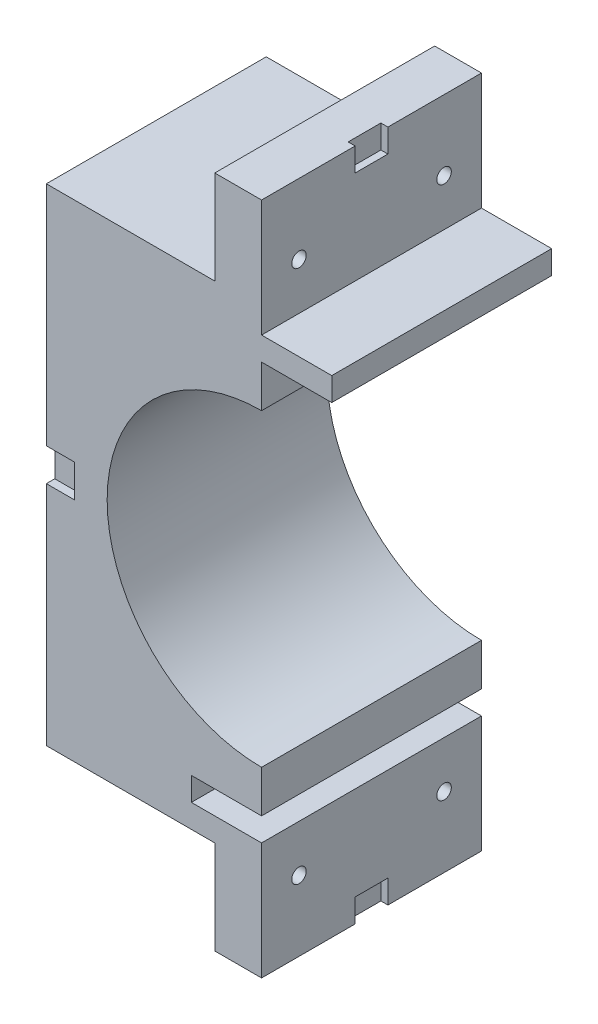
ISO-10303-21;
HEADER;
FILE_DESCRIPTION(('STEP AP214'),'2;1');
FILE_NAME('part.step','',(''),(''),'','','');
FILE_SCHEMA(('AUTOMOTIVE_DESIGN { 1 0 10303 214 1 1 1 1 }'));
ENDSEC;
DATA;
#1=APPLICATION_CONTEXT('core data for automotive mechanical design processes');
#2=APPLICATION_PROTOCOL_DEFINITION('international standard','automotive_design',2000,#1);
#3=PRODUCT_CONTEXT('',#1,'mechanical');
#4=PRODUCT('Part','Part','',(#3));
#5=PRODUCT_RELATED_PRODUCT_CATEGORY('part','',(#4));
#6=PRODUCT_DEFINITION_FORMATION('','',#4);
#7=PRODUCT_DEFINITION_CONTEXT('part definition',#1,'design');
#8=PRODUCT_DEFINITION('design','',#6,#7);
#9=PRODUCT_DEFINITION_SHAPE('','',#8);
#10=(LENGTH_UNIT() NAMED_UNIT(*) SI_UNIT(.MILLI.,.METRE.));
#11=(NAMED_UNIT(*) PLANE_ANGLE_UNIT() SI_UNIT($,.RADIAN.));
#12=(NAMED_UNIT(*) SI_UNIT($,.STERADIAN.) SOLID_ANGLE_UNIT());
#13=UNCERTAINTY_MEASURE_WITH_UNIT(LENGTH_MEASURE(1.E-05),#10,'distance_accuracy_value','');
#14=(GEOMETRIC_REPRESENTATION_CONTEXT(3) GLOBAL_UNCERTAINTY_ASSIGNED_CONTEXT((#13)) GLOBAL_UNIT_ASSIGNED_CONTEXT((#10,
#11,#12)) REPRESENTATION_CONTEXT('',''));
#15=CARTESIAN_POINT('',(0.,0.,0.));
#16=DIRECTION('',(0.,0.,1.));
#17=DIRECTION('',(1.,0.,0.));
#18=AXIS2_PLACEMENT_3D('',#15,#16,#17);
#19=CARTESIAN_POINT('',(0.,33.,47.));
#20=DIRECTION('',(-1.,0.,0.));
#21=DIRECTION('',(0.,0.,1.));
#22=AXIS2_PLACEMENT_3D('',#19,#20,#21);
#23=PLANE('',#22);
#24=CARTESIAN_POINT('',(0.,57.,8.));
#25=DIRECTION('',(-1.,0.,0.));
#26=DIRECTION('',(0.,0.,1.));
#27=AXIS2_PLACEMENT_3D('',#24,#25,#26);
#28=CIRCLE('',#27,1.55);
#29=CARTESIAN_POINT('',(0.,57.,9.55));
#30=VERTEX_POINT('',#29);
#31=EDGE_CURVE('E308',#30,#30,#28,.T.);
#32=ORIENTED_EDGE('',*,*,#31,.T.);
#33=EDGE_LOOP('',(#32));
#34=FACE_BOUND('',#33,.T.);
#35=CARTESIAN_POINT('',(0.,57.,39.));
#36=DIRECTION('',(-1.,0.,0.));
#37=DIRECTION('',(0.,0.,1.));
#38=AXIS2_PLACEMENT_3D('',#35,#36,#37);
#39=CIRCLE('',#38,1.55);
#40=CARTESIAN_POINT('',(0.,57.,40.55));
#41=VERTEX_POINT('',#40);
#42=EDGE_CURVE('E303',#41,#41,#39,.T.);
#43=ORIENTED_EDGE('',*,*,#42,.T.);
#44=EDGE_LOOP('',(#43));
#45=FACE_BOUND('',#44,.T.);
#46=DIRECTION('',(0.,0.,-1.));
#47=VECTOR('',#46,1.);
#48=CARTESIAN_POINT('',(0.,67.,27.));
#49=LINE('',#48,#47);
#50=CARTESIAN_POINT('',(0.,67.,27.));
#51=VERTEX_POINT('',#50);
#52=CARTESIAN_POINT('',(0.,67.,20.));
#53=VERTEX_POINT('',#52);
#54=EDGE_CURVE('E271',#51,#53,#49,.T.);
#55=ORIENTED_EDGE('',*,*,#54,.F.);
#56=DIRECTION('',(0.,1.,0.));
#57=VECTOR('',#56,1.);
#58=CARTESIAN_POINT('',(0.,67.,27.));
#59=LINE('',#58,#57);
#60=CARTESIAN_POINT('',(0.,72.,27.));
#61=VERTEX_POINT('',#60);
#62=EDGE_CURVE('E291',#51,#61,#59,.T.);
#63=ORIENTED_EDGE('',*,*,#62,.T.);
#64=DIRECTION('',(0.,0.,1.));
#65=VECTOR('',#64,1.);
#66=CARTESIAN_POINT('',(0.,72.,47.));
#67=LINE('',#66,#65);
#68=CARTESIAN_POINT('',(0.,72.,47.));
#69=VERTEX_POINT('',#68);
#70=EDGE_CURVE('E425',#61,#69,#67,.T.);
#71=ORIENTED_EDGE('',*,*,#70,.T.);
#72=DIRECTION('',(0.,1.,0.));
#73=VECTOR('',#72,1.);
#74=CARTESIAN_POINT('',(0.,33.,47.));
#75=LINE('',#74,#73);
#76=CARTESIAN_POINT('',(0.,47.,47.));
#77=VERTEX_POINT('',#76);
#78=EDGE_CURVE('E444',#77,#69,#75,.T.);
#79=ORIENTED_EDGE('',*,*,#78,.F.);
#80=DIRECTION('',(0.,0.,1.));
#81=VECTOR('',#80,1.);
#82=CARTESIAN_POINT('',(0.,47.,0.));
#83=LINE('',#82,#81);
#84=CARTESIAN_POINT('',(0.,47.,0.));
#85=VERTEX_POINT('',#84);
#86=EDGE_CURVE('E366',#85,#77,#83,.T.);
#87=ORIENTED_EDGE('',*,*,#86,.F.);
#88=DIRECTION('',(0.,1.,0.));
#89=VECTOR('',#88,1.);
#90=CARTESIAN_POINT('',(0.,33.,0.));
#91=LINE('',#90,#89);
#92=CARTESIAN_POINT('',(0.,72.,0.));
#93=VERTEX_POINT('',#92);
#94=EDGE_CURVE('E463',#85,#93,#91,.T.);
#95=ORIENTED_EDGE('',*,*,#94,.T.);
#96=CARTESIAN_POINT('',(0.,72.,20.));
#97=VERTEX_POINT('',#96);
#98=EDGE_CURVE('E421',#93,#97,#67,.T.);
#99=ORIENTED_EDGE('',*,*,#98,.T.);
#100=DIRECTION('',(0.,1.,0.));
#101=VECTOR('',#100,1.);
#102=CARTESIAN_POINT('',(0.,67.,20.));
#103=LINE('',#102,#101);
#104=EDGE_CURVE('E68',#53,#97,#103,.T.);
#105=ORIENTED_EDGE('',*,*,#104,.F.);
#106=EDGE_LOOP('',(#55,#63,#71,#79,#87,#95,#99,#105));
#107=FACE_BOUND('',#106,.T.);
#108=ADVANCED_FACE('F43',(#34,#45,#107),#23,.F.);
#109=CARTESIAN_POINT('',(0.,-52.,47.));
#110=DIRECTION('',(-1.,0.,0.));
#111=DIRECTION('',(0.,0.,1.));
#112=AXIS2_PLACEMENT_3D('',#109,#110,#111);
#113=PLANE('',#112);
#114=CARTESIAN_POINT('',(0.,-57.,39.));
#115=DIRECTION('',(1.,0.,0.));
#116=DIRECTION('',(0.,0.,-1.));
#117=AXIS2_PLACEMENT_3D('',#114,#115,#116);
#118=CIRCLE('',#117,1.55);
#119=CARTESIAN_POINT('',(0.,-57.,37.45));
#120=VERTEX_POINT('',#119);
#121=EDGE_CURVE('E312',#120,#120,#118,.T.);
#122=ORIENTED_EDGE('',*,*,#121,.F.);
#123=EDGE_LOOP('',(#122));
#124=FACE_BOUND('',#123,.T.);
#125=CARTESIAN_POINT('',(0.,-57.,8.00000000000001));
#126=DIRECTION('',(1.,0.,0.));
#127=DIRECTION('',(0.,0.,-1.));
#128=AXIS2_PLACEMENT_3D('',#125,#126,#127);
#129=CIRCLE('',#128,1.55);
#130=CARTESIAN_POINT('',(0.,-57.,6.45000000000001));
#131=VERTEX_POINT('',#130);
#132=EDGE_CURVE('E311',#131,#131,#129,.T.);
#133=ORIENTED_EDGE('',*,*,#132,.F.);
#134=EDGE_LOOP('',(#133));
#135=FACE_BOUND('',#134,.T.);
#136=DIRECTION('',(0.,0.,1.));
#137=VECTOR('',#136,1.);
#138=CARTESIAN_POINT('',(0.,-67.,27.));
#139=LINE('',#138,#137);
#140=CARTESIAN_POINT('',(0.,-67.,20.));
#141=VERTEX_POINT('',#140);
#142=CARTESIAN_POINT('',(0.,-67.,27.));
#143=VERTEX_POINT('',#142);
#144=EDGE_CURVE('E318',#141,#143,#139,.T.);
#145=ORIENTED_EDGE('',*,*,#144,.F.);
#146=DIRECTION('',(0.,-1.,0.));
#147=VECTOR('',#146,1.);
#148=CARTESIAN_POINT('',(0.,-67.,20.));
#149=LINE('',#148,#147);
#150=CARTESIAN_POINT('',(0.,-72.,20.));
#151=VERTEX_POINT('',#150);
#152=EDGE_CURVE('E339',#141,#151,#149,.T.);
#153=ORIENTED_EDGE('',*,*,#152,.T.);
#154=DIRECTION('',(0.,0.,-1.));
#155=VECTOR('',#154,1.);
#156=CARTESIAN_POINT('',(0.,-72.,47.));
#157=LINE('',#156,#155);
#158=CARTESIAN_POINT('',(0.,-72.,0.));
#159=VERTEX_POINT('',#158);
#160=EDGE_CURVE('E405',#151,#159,#157,.T.);
#161=ORIENTED_EDGE('',*,*,#160,.T.);
#162=DIRECTION('',(0.,1.,0.));
#163=VECTOR('',#162,1.);
#164=CARTESIAN_POINT('',(0.,-52.,0.));
#165=LINE('',#164,#163);
#166=CARTESIAN_POINT('',(0.,-47.,0.));
#167=VERTEX_POINT('',#166);
#168=EDGE_CURVE('E445',#159,#167,#165,.T.);
#169=ORIENTED_EDGE('',*,*,#168,.T.);
#170=DIRECTION('',(0.,0.,1.));
#171=VECTOR('',#170,1.);
#172=CARTESIAN_POINT('',(0.,-47.,0.));
#173=LINE('',#172,#171);
#174=CARTESIAN_POINT('',(0.,-47.,47.));
#175=VERTEX_POINT('',#174);
#176=EDGE_CURVE('E392',#167,#175,#173,.T.);
#177=ORIENTED_EDGE('',*,*,#176,.T.);
#178=DIRECTION('',(0.,1.,0.));
#179=VECTOR('',#178,1.);
#180=CARTESIAN_POINT('',(0.,-52.,47.));
#181=LINE('',#180,#179);
#182=CARTESIAN_POINT('',(0.,-72.,47.));
#183=VERTEX_POINT('',#182);
#184=EDGE_CURVE('E457',#183,#175,#181,.T.);
#185=ORIENTED_EDGE('',*,*,#184,.F.);
#186=CARTESIAN_POINT('',(0.,-72.,27.));
#187=VERTEX_POINT('',#186);
#188=EDGE_CURVE('E401',#183,#187,#157,.T.);
#189=ORIENTED_EDGE('',*,*,#188,.T.);
#190=DIRECTION('',(0.,-1.,0.));
#191=VECTOR('',#190,1.);
#192=CARTESIAN_POINT('',(0.,-67.,27.));
#193=LINE('',#192,#191);
#194=EDGE_CURVE('E331',#143,#187,#193,.T.);
#195=ORIENTED_EDGE('',*,*,#194,.F.);
#196=EDGE_LOOP('',(#145,#153,#161,#169,#177,#185,#189,#195));
#197=FACE_BOUND('',#196,.T.);
#198=ADVANCED_FACE('F508',(#124,#135,#197),#113,.F.);
#199=CARTESIAN_POINT('',(0.,0.,47.));
#200=DIRECTION('',(0.,0.,-1.));
#201=DIRECTION('',(-1.,0.,0.));
#202=AXIS2_PLACEMENT_3D('',#199,#200,#201);
#203=CYLINDRICAL_SURFACE('',#202,33.);
#204=CARTESIAN_POINT('',(0.,0.,0.));
#205=DIRECTION('',(0.,0.,-1.));
#206=DIRECTION('',(1.,0.,0.));
#207=AXIS2_PLACEMENT_3D('',#204,#205,#206);
#208=CIRCLE('',#207,33.);
#209=CARTESIAN_POINT('',(0.,-33.,0.));
#210=VERTEX_POINT('',#209);
#211=CARTESIAN_POINT('',(0.,33.,0.));
#212=VERTEX_POINT('',#211);
#213=EDGE_CURVE('E440',#210,#212,#208,.T.);
#214=ORIENTED_EDGE('',*,*,#213,.T.);
#215=DIRECTION('',(0.,0.,-1.));
#216=VECTOR('',#215,1.);
#217=CARTESIAN_POINT('',(0.,33.,47.));
#218=LINE('',#217,#216);
#219=CARTESIAN_POINT('',(0.,33.,47.));
#220=VERTEX_POINT('',#219);
#221=EDGE_CURVE('E11',#220,#212,#218,.T.);
#222=ORIENTED_EDGE('',*,*,#221,.F.);
#223=CARTESIAN_POINT('',(0.,0.,47.));
#224=DIRECTION('',(0.,0.,-1.));
#225=DIRECTION('',(1.,0.,0.));
#226=AXIS2_PLACEMENT_3D('',#223,#224,#225);
#227=CIRCLE('',#226,33.);
#228=CARTESIAN_POINT('',(0.,-33.,47.));
#229=VERTEX_POINT('',#228);
#230=EDGE_CURVE('E441',#229,#220,#227,.T.);
#231=ORIENTED_EDGE('',*,*,#230,.F.);
#232=DIRECTION('',(0.,0.,-1.));
#233=VECTOR('',#232,1.);
#234=CARTESIAN_POINT('',(0.,-33.,47.));
#235=LINE('',#234,#233);
#236=EDGE_CURVE('E460',#229,#210,#235,.T.);
#237=ORIENTED_EDGE('',*,*,#236,.T.);
#238=EDGE_LOOP('',(#214,#222,#231,#237));
#239=FACE_BOUND('',#238,.T.);
#240=ADVANCED_FACE('F45',(#239),#203,.F.);
#241=CARTESIAN_POINT('',(0.,42.,0.));
#242=VERTEX_POINT('',#241);
#243=EDGE_CURVE('E464',#212,#242,#91,.T.);
#244=ORIENTED_EDGE('',*,*,#243,.T.);
#245=DIRECTION('',(0.,0.,1.));
#246=VECTOR('',#245,1.);
#247=CARTESIAN_POINT('',(0.,42.,0.));
#248=LINE('',#247,#246);
#249=CARTESIAN_POINT('',(0.,42.,47.));
#250=VERTEX_POINT('',#249);
#251=EDGE_CURVE('E358',#242,#250,#248,.T.);
#252=ORIENTED_EDGE('',*,*,#251,.T.);
#253=EDGE_CURVE('E446',#220,#250,#75,.T.);
#254=ORIENTED_EDGE('',*,*,#253,.F.);
#255=ORIENTED_EDGE('',*,*,#221,.T.);
#256=EDGE_LOOP('',(#244,#252,#254,#255));
#257=FACE_BOUND('',#256,.T.);
#258=ADVANCED_FACE('F510',(#257),#23,.F.);
#259=CARTESIAN_POINT('',(0.,52.,47.));
#260=DIRECTION('',(0.,-1.,0.));
#261=DIRECTION('',(1.,0.,0.));
#262=AXIS2_PLACEMENT_3D('',#259,#260,#261);
#263=PLANE('',#262);
#264=DIRECTION('',(-1.,0.,0.));
#265=VECTOR('',#264,1.);
#266=CARTESIAN_POINT('',(0.,52.,47.));
#267=LINE('',#266,#265);
#268=CARTESIAN_POINT('',(-10.,52.,47.));
#269=VERTEX_POINT('',#268);
#270=CARTESIAN_POINT('',(-46.,52.,47.));
#271=VERTEX_POINT('',#270);
#272=EDGE_CURVE('E449',#269,#271,#267,.T.);
#273=ORIENTED_EDGE('',*,*,#272,.F.);
#274=DIRECTION('',(0.,0.,-1.));
#275=VECTOR('',#274,1.);
#276=CARTESIAN_POINT('',(-10.,52.,47.));
#277=LINE('',#276,#275);
#278=CARTESIAN_POINT('',(-10.,52.,0.));
#279=VERTEX_POINT('',#278);
#280=EDGE_CURVE('E428',#269,#279,#277,.T.);
#281=ORIENTED_EDGE('',*,*,#280,.T.);
#282=DIRECTION('',(-1.,0.,0.));
#283=VECTOR('',#282,1.);
#284=CARTESIAN_POINT('',(0.,52.,0.));
#285=LINE('',#284,#283);
#286=CARTESIAN_POINT('',(-46.,52.,0.));
#287=VERTEX_POINT('',#286);
#288=EDGE_CURVE('E466',#279,#287,#285,.T.);
#289=ORIENTED_EDGE('',*,*,#288,.T.);
#290=DIRECTION('',(0.,0.,-1.));
#291=VECTOR('',#290,1.);
#292=CARTESIAN_POINT('',(-46.,52.,47.));
#293=LINE('',#292,#291);
#294=EDGE_CURVE('E52',#271,#287,#293,.T.);
#295=ORIENTED_EDGE('',*,*,#294,.F.);
#296=EDGE_LOOP('',(#273,#281,#289,#295));
#297=FACE_BOUND('',#296,.T.);
#298=ADVANCED_FACE('F522',(#297),#263,.F.);
#299=CARTESIAN_POINT('',(-46.,52.,47.));
#300=DIRECTION('',(1.,0.,0.));
#301=DIRECTION('',(0.,1.,0.));
#302=AXIS2_PLACEMENT_3D('',#299,#300,#301);
#303=PLANE('',#302);
#304=DIRECTION('',(0.,-1.,0.));
#305=VECTOR('',#304,1.);
#306=CARTESIAN_POINT('',(-46.,52.,47.));
#307=LINE('',#306,#305);
#308=CARTESIAN_POINT('',(-46.,-3.5,47.));
#309=VERTEX_POINT('',#308);
#310=CARTESIAN_POINT('',(-46.,-52.,47.));
#311=VERTEX_POINT('',#310);
#312=EDGE_CURVE('E451',#309,#311,#307,.T.);
#313=ORIENTED_EDGE('',*,*,#312,.F.);
#314=DIRECTION('',(0.,0.,1.));
#315=VECTOR('',#314,1.);
#316=CARTESIAN_POINT('',(-46.,-3.5,47.));
#317=LINE('',#316,#315);
#318=CARTESIAN_POINT('',(-46.,-3.5,45.2));
#319=VERTEX_POINT('',#318);
#320=EDGE_CURVE('E259',#319,#309,#317,.T.);
#321=ORIENTED_EDGE('',*,*,#320,.F.);
#322=DIRECTION('',(0.,-1.,0.));
#323=VECTOR('',#322,1.);
#324=CARTESIAN_POINT('',(-46.,-3.5,45.2));
#325=LINE('',#324,#323);
#326=CARTESIAN_POINT('',(-46.,3.5,45.2));
#327=VERTEX_POINT('',#326);
#328=EDGE_CURVE('E924',#327,#319,#325,.T.);
#329=ORIENTED_EDGE('',*,*,#328,.F.);
#330=DIRECTION('',(0.,0.,-1.));
#331=VECTOR('',#330,1.);
#332=CARTESIAN_POINT('',(-46.,3.5,47.));
#333=LINE('',#332,#331);
#334=CARTESIAN_POINT('',(-46.,3.5,47.));
#335=VERTEX_POINT('',#334);
#336=EDGE_CURVE('E926',#335,#327,#333,.T.);
#337=ORIENTED_EDGE('',*,*,#336,.F.);
#338=EDGE_CURVE('E264',#271,#335,#307,.T.);
#339=ORIENTED_EDGE('',*,*,#338,.F.);
#340=ORIENTED_EDGE('',*,*,#294,.T.);
#341=DIRECTION('',(0.,-1.,0.));
#342=VECTOR('',#341,1.);
#343=CARTESIAN_POINT('',(-46.,52.,0.));
#344=LINE('',#343,#342);
#345=CARTESIAN_POINT('',(-46.,-52.,0.));
#346=VERTEX_POINT('',#345);
#347=EDGE_CURVE('E468',#287,#346,#344,.T.);
#348=ORIENTED_EDGE('',*,*,#347,.T.);
#349=DIRECTION('',(0.,0.,-1.));
#350=VECTOR('',#349,1.);
#351=CARTESIAN_POINT('',(-46.,-52.,47.));
#352=LINE('',#351,#350);
#353=EDGE_CURVE('E478',#311,#346,#352,.T.);
#354=ORIENTED_EDGE('',*,*,#353,.F.);
#355=EDGE_LOOP('',(#313,#321,#329,#337,#339,#340,#348,#354));
#356=FACE_BOUND('',#355,.T.);
#357=ADVANCED_FACE('F529',(#356),#303,.F.);
#358=CARTESIAN_POINT('',(-46.,-52.,47.));
#359=DIRECTION('',(0.,1.,0.));
#360=DIRECTION('',(0.,0.,1.));
#361=AXIS2_PLACEMENT_3D('',#358,#359,#360);
#362=PLANE('',#361);
#363=DIRECTION('',(1.,0.,0.));
#364=VECTOR('',#363,1.);
#365=CARTESIAN_POINT('',(-46.,-52.,0.));
#366=LINE('',#365,#364);
#367=CARTESIAN_POINT('',(-10.,-52.,0.));
#368=VERTEX_POINT('',#367);
#369=EDGE_CURVE('E470',#346,#368,#366,.T.);
#370=ORIENTED_EDGE('',*,*,#369,.T.);
#371=DIRECTION('',(0.,0.,1.));
#372=VECTOR('',#371,1.);
#373=CARTESIAN_POINT('',(-10.,-52.,47.));
#374=LINE('',#373,#372);
#375=CARTESIAN_POINT('',(-10.,-52.,47.));
#376=VERTEX_POINT('',#375);
#377=EDGE_CURVE('E412',#368,#376,#374,.T.);
#378=ORIENTED_EDGE('',*,*,#377,.T.);
#379=DIRECTION('',(1.,0.,0.));
#380=VECTOR('',#379,1.);
#381=CARTESIAN_POINT('',(-46.,-52.,47.));
#382=LINE('',#381,#380);
#383=EDGE_CURVE('E453',#311,#376,#382,.T.);
#384=ORIENTED_EDGE('',*,*,#383,.F.);
#385=ORIENTED_EDGE('',*,*,#353,.T.);
#386=EDGE_LOOP('',(#370,#378,#384,#385));
#387=FACE_BOUND('',#386,.T.);
#388=ADVANCED_FACE('F579',(#387),#362,.F.);
#389=CARTESIAN_POINT('',(0.,-42.,47.));
#390=VERTEX_POINT('',#389);
#391=EDGE_CURVE('E456',#390,#229,#181,.T.);
#392=ORIENTED_EDGE('',*,*,#391,.F.);
#393=DIRECTION('',(0.,0.,1.));
#394=VECTOR('',#393,1.);
#395=CARTESIAN_POINT('',(0.,-42.,0.));
#396=LINE('',#395,#394);
#397=CARTESIAN_POINT('',(0.,-42.,0.));
#398=VERTEX_POINT('',#397);
#399=EDGE_CURVE('E385',#398,#390,#396,.T.);
#400=ORIENTED_EDGE('',*,*,#399,.F.);
#401=EDGE_CURVE('E473',#398,#210,#165,.T.);
#402=ORIENTED_EDGE('',*,*,#401,.T.);
#403=ORIENTED_EDGE('',*,*,#236,.F.);
#404=EDGE_LOOP('',(#392,#400,#402,#403));
#405=FACE_BOUND('',#404,.T.);
#406=ADVANCED_FACE('F518',(#405),#113,.F.);
#407=CARTESIAN_POINT('',(0.,0.,47.));
#408=DIRECTION('',(0.,0.,1.));
#409=DIRECTION('',(1.,0.,0.));
#410=AXIS2_PLACEMENT_3D('',#407,#408,#409);
#411=PLANE('',#410);
#412=DIRECTION('',(-1.,0.,0.));
#413=VECTOR('',#412,1.);
#414=CARTESIAN_POINT('',(-40.,-3.5,47.));
#415=LINE('',#414,#413);
#416=CARTESIAN_POINT('',(-40.,-3.5,47.));
#417=VERTEX_POINT('',#416);
#418=EDGE_CURVE('E287',#417,#309,#415,.T.);
#419=ORIENTED_EDGE('',*,*,#418,.T.);
#420=ORIENTED_EDGE('',*,*,#312,.T.);
#421=ORIENTED_EDGE('',*,*,#383,.T.);
#422=DIRECTION('',(0.,-1.,0.));
#423=VECTOR('',#422,1.);
#424=CARTESIAN_POINT('',(-10.,-52.,47.));
#425=LINE('',#424,#423);
#426=CARTESIAN_POINT('',(-10.,-72.,47.));
#427=VERTEX_POINT('',#426);
#428=EDGE_CURVE('E395',#376,#427,#425,.T.);
#429=ORIENTED_EDGE('',*,*,#428,.T.);
#430=DIRECTION('',(-1.,0.,0.));
#431=VECTOR('',#430,1.);
#432=CARTESIAN_POINT('',(0.,-72.,47.));
#433=LINE('',#432,#431);
#434=EDGE_CURVE('E417',#183,#427,#433,.T.);
#435=ORIENTED_EDGE('',*,*,#434,.F.);
#436=ORIENTED_EDGE('',*,*,#184,.T.);
#437=DIRECTION('',(1.,0.,0.));
#438=VECTOR('',#437,1.);
#439=CARTESIAN_POINT('',(0.,-47.,47.));
#440=LINE('',#439,#438);
#441=CARTESIAN_POINT('',(-15.,-47.,47.));
#442=VERTEX_POINT('',#441);
#443=EDGE_CURVE('E379',#442,#175,#440,.T.);
#444=ORIENTED_EDGE('',*,*,#443,.F.);
#445=DIRECTION('',(0.,-1.,0.));
#446=VECTOR('',#445,1.);
#447=CARTESIAN_POINT('',(-15.,-42.,47.));
#448=LINE('',#447,#446);
#449=CARTESIAN_POINT('',(-15.,-42.,47.));
#450=VERTEX_POINT('',#449);
#451=EDGE_CURVE('E388',#450,#442,#448,.T.);
#452=ORIENTED_EDGE('',*,*,#451,.F.);
#453=DIRECTION('',(-1.,0.,0.));
#454=VECTOR('',#453,1.);
#455=CARTESIAN_POINT('',(0.,-42.,47.));
#456=LINE('',#455,#454);
#457=EDGE_CURVE('E369',#390,#450,#456,.T.);
#458=ORIENTED_EDGE('',*,*,#457,.F.);
#459=ORIENTED_EDGE('',*,*,#391,.T.);
#460=ORIENTED_EDGE('',*,*,#230,.T.);
#461=ORIENTED_EDGE('',*,*,#253,.T.);
#462=DIRECTION('',(1.,0.,0.));
#463=VECTOR('',#462,1.);
#464=CARTESIAN_POINT('',(0.,42.,47.));
#465=LINE('',#464,#463);
#466=CARTESIAN_POINT('',(15.,42.,47.));
#467=VERTEX_POINT('',#466);
#468=EDGE_CURVE('E342',#250,#467,#465,.T.);
#469=ORIENTED_EDGE('',*,*,#468,.T.);
#470=DIRECTION('',(0.,1.,0.));
#471=VECTOR('',#470,1.);
#472=CARTESIAN_POINT('',(15.,47.,47.));
#473=LINE('',#472,#471);
#474=CARTESIAN_POINT('',(15.,47.,47.));
#475=VERTEX_POINT('',#474);
#476=EDGE_CURVE('E361',#467,#475,#473,.T.);
#477=ORIENTED_EDGE('',*,*,#476,.T.);
#478=DIRECTION('',(-1.,0.,0.));
#479=VECTOR('',#478,1.);
#480=CARTESIAN_POINT('',(0.,47.,47.));
#481=LINE('',#480,#479);
#482=EDGE_CURVE('E352',#475,#77,#481,.T.);
#483=ORIENTED_EDGE('',*,*,#482,.T.);
#484=ORIENTED_EDGE('',*,*,#78,.T.);
#485=DIRECTION('',(-1.,0.,0.));
#486=VECTOR('',#485,1.);
#487=CARTESIAN_POINT('',(0.,72.,47.));
#488=LINE('',#487,#486);
#489=CARTESIAN_POINT('',(-10.,72.,47.));
#490=VERTEX_POINT('',#489);
#491=EDGE_CURVE('E424',#69,#490,#488,.T.);
#492=ORIENTED_EDGE('',*,*,#491,.T.);
#493=DIRECTION('',(0.,-1.,0.));
#494=VECTOR('',#493,1.);
#495=CARTESIAN_POINT('',(-10.,52.,47.));
#496=LINE('',#495,#494);
#497=EDGE_CURVE('E420',#490,#269,#496,.T.);
#498=ORIENTED_EDGE('',*,*,#497,.T.);
#499=ORIENTED_EDGE('',*,*,#272,.T.);
#500=ORIENTED_EDGE('',*,*,#338,.T.);
#501=DIRECTION('',(-1.,0.,0.));
#502=VECTOR('',#501,1.);
#503=CARTESIAN_POINT('',(-40.,3.5,47.));
#504=LINE('',#503,#502);
#505=CARTESIAN_POINT('',(-40.,3.5,47.));
#506=VERTEX_POINT('',#505);
#507=EDGE_CURVE('E248',#506,#335,#504,.T.);
#508=ORIENTED_EDGE('',*,*,#507,.F.);
#509=DIRECTION('',(0.,1.,0.));
#510=VECTOR('',#509,1.);
#511=CARTESIAN_POINT('',(-40.,-3.5,47.));
#512=LINE('',#511,#510);
#513=EDGE_CURVE('E253',#417,#506,#512,.T.);
#514=ORIENTED_EDGE('',*,*,#513,.F.);
#515=EDGE_LOOP('',(#419,#420,#421,#429,#435,#436,#444,#452,#458,#459,#460,#461,#469,#477,#483,
#484,#492,#498,#499,#500,#508,#514));
#516=FACE_BOUND('',#515,.T.);
#517=ADVANCED_FACE('F262',(#516),#411,.T.);
#518=CARTESIAN_POINT('',(0.,0.,0.));
#519=DIRECTION('',(0.,0.,1.));
#520=DIRECTION('',(1.,0.,0.));
#521=AXIS2_PLACEMENT_3D('',#518,#519,#520);
#522=PLANE('',#521);
#523=DIRECTION('',(0.,-1.,0.));
#524=VECTOR('',#523,1.);
#525=CARTESIAN_POINT('',(-15.,-42.,0.));
#526=LINE('',#525,#524);
#527=CARTESIAN_POINT('',(-15.,-42.,0.));
#528=VERTEX_POINT('',#527);
#529=CARTESIAN_POINT('',(-15.,-47.,0.));
#530=VERTEX_POINT('',#529);
#531=EDGE_CURVE('E378',#528,#530,#526,.T.);
#532=ORIENTED_EDGE('',*,*,#531,.T.);
#533=DIRECTION('',(1.,0.,0.));
#534=VECTOR('',#533,1.);
#535=CARTESIAN_POINT('',(0.,-47.,0.));
#536=LINE('',#535,#534);
#537=EDGE_CURVE('E382',#530,#167,#536,.T.);
#538=ORIENTED_EDGE('',*,*,#537,.T.);
#539=ORIENTED_EDGE('',*,*,#168,.F.);
#540=DIRECTION('',(-1.,0.,0.));
#541=VECTOR('',#540,1.);
#542=CARTESIAN_POINT('',(0.,-72.,0.));
#543=LINE('',#542,#541);
#544=CARTESIAN_POINT('',(-10.,-72.,0.));
#545=VERTEX_POINT('',#544);
#546=EDGE_CURVE('E404',#159,#545,#543,.T.);
#547=ORIENTED_EDGE('',*,*,#546,.T.);
#548=DIRECTION('',(0.,1.,0.));
#549=VECTOR('',#548,1.);
#550=CARTESIAN_POINT('',(-10.,-52.,0.));
#551=LINE('',#550,#549);
#552=EDGE_CURVE('E410',#545,#368,#551,.T.);
#553=ORIENTED_EDGE('',*,*,#552,.T.);
#554=ORIENTED_EDGE('',*,*,#369,.F.);
#555=ORIENTED_EDGE('',*,*,#347,.F.);
#556=ORIENTED_EDGE('',*,*,#288,.F.);
#557=DIRECTION('',(0.,1.,0.));
#558=VECTOR('',#557,1.);
#559=CARTESIAN_POINT('',(-10.,52.,0.));
#560=LINE('',#559,#558);
#561=CARTESIAN_POINT('',(-10.,72.,0.));
#562=VERTEX_POINT('',#561);
#563=EDGE_CURVE('E431',#279,#562,#560,.T.);
#564=ORIENTED_EDGE('',*,*,#563,.T.);
#565=DIRECTION('',(-1.,0.,0.));
#566=VECTOR('',#565,1.);
#567=CARTESIAN_POINT('',(0.,72.,0.));
#568=LINE('',#567,#566);
#569=EDGE_CURVE('E437',#93,#562,#568,.T.);
#570=ORIENTED_EDGE('',*,*,#569,.F.);
#571=ORIENTED_EDGE('',*,*,#94,.F.);
#572=DIRECTION('',(-1.,0.,0.));
#573=VECTOR('',#572,1.);
#574=CARTESIAN_POINT('',(0.,47.,0.));
#575=LINE('',#574,#573);
#576=CARTESIAN_POINT('',(15.,47.,0.));
#577=VERTEX_POINT('',#576);
#578=EDGE_CURVE('E355',#577,#85,#575,.T.);
#579=ORIENTED_EDGE('',*,*,#578,.F.);
#580=DIRECTION('',(0.,1.,0.));
#581=VECTOR('',#580,1.);
#582=CARTESIAN_POINT('',(15.,47.,0.));
#583=LINE('',#582,#581);
#584=CARTESIAN_POINT('',(15.,42.,0.));
#585=VERTEX_POINT('',#584);
#586=EDGE_CURVE('E351',#585,#577,#583,.T.);
#587=ORIENTED_EDGE('',*,*,#586,.F.);
#588=DIRECTION('',(1.,0.,0.));
#589=VECTOR('',#588,1.);
#590=CARTESIAN_POINT('',(0.,42.,0.));
#591=LINE('',#590,#589);
#592=EDGE_CURVE('E348',#242,#585,#591,.T.);
#593=ORIENTED_EDGE('',*,*,#592,.F.);
#594=ORIENTED_EDGE('',*,*,#243,.F.);
#595=ORIENTED_EDGE('',*,*,#213,.F.);
#596=ORIENTED_EDGE('',*,*,#401,.F.);
#597=DIRECTION('',(-1.,0.,0.));
#598=VECTOR('',#597,1.);
#599=CARTESIAN_POINT('',(0.,-42.,0.));
#600=LINE('',#599,#598);
#601=EDGE_CURVE('E375',#398,#528,#600,.T.);
#602=ORIENTED_EDGE('',*,*,#601,.T.);
#603=EDGE_LOOP('',(#532,#538,#539,#547,#553,#554,#555,#556,#564,#570,#571,#579,#587,#593,#594,
#595,#596,#602));
#604=FACE_BOUND('',#603,.T.);
#605=ADVANCED_FACE('F542',(#604),#522,.F.);
#606=CARTESIAN_POINT('',(0.,72.,47.));
#607=DIRECTION('',(0.,-1.,0.));
#608=DIRECTION('',(0.,0.,-1.));
#609=AXIS2_PLACEMENT_3D('',#606,#607,#608);
#610=PLANE('',#609);
#611=ORIENTED_EDGE('',*,*,#70,.F.);
#612=DIRECTION('',(1.,0.,0.));
#613=VECTOR('',#612,1.);
#614=CARTESIAN_POINT('',(-1.50000000000002,72.,27.));
#615=LINE('',#614,#613);
#616=CARTESIAN_POINT('',(-1.50000000000002,72.,27.));
#617=VERTEX_POINT('',#616);
#618=EDGE_CURVE('E275',#617,#61,#615,.T.);
#619=ORIENTED_EDGE('',*,*,#618,.F.);
#620=DIRECTION('',(0.,0.,1.));
#621=VECTOR('',#620,1.);
#622=CARTESIAN_POINT('',(-1.50000000000002,72.,20.));
#623=LINE('',#622,#621);
#624=CARTESIAN_POINT('',(-1.50000000000002,72.,20.));
#625=VERTEX_POINT('',#624);
#626=EDGE_CURVE('E286',#625,#617,#623,.T.);
#627=ORIENTED_EDGE('',*,*,#626,.F.);
#628=DIRECTION('',(-1.,0.,0.));
#629=VECTOR('',#628,1.);
#630=CARTESIAN_POINT('',(0.,72.,20.));
#631=LINE('',#630,#629);
#632=EDGE_CURVE('E284',#97,#625,#631,.T.);
#633=ORIENTED_EDGE('',*,*,#632,.F.);
#634=ORIENTED_EDGE('',*,*,#98,.F.);
#635=ORIENTED_EDGE('',*,*,#569,.T.);
#636=DIRECTION('',(0.,0.,1.));
#637=VECTOR('',#636,1.);
#638=CARTESIAN_POINT('',(-10.,72.,47.));
#639=LINE('',#638,#637);
#640=EDGE_CURVE('E433',#562,#490,#639,.T.);
#641=ORIENTED_EDGE('',*,*,#640,.T.);
#642=ORIENTED_EDGE('',*,*,#491,.F.);
#643=EDGE_LOOP('',(#611,#619,#627,#633,#634,#635,#641,#642));
#644=FACE_BOUND('',#643,.T.);
#645=ADVANCED_FACE('F595',(#644),#610,.F.);
#646=CARTESIAN_POINT('',(-10.,0.,0.));
#647=DIRECTION('',(-1.,0.,0.));
#648=DIRECTION('',(0.,0.,1.));
#649=AXIS2_PLACEMENT_3D('',#646,#647,#648);
#650=PLANE('',#649);
#651=CARTESIAN_POINT('',(-10.,57.,8.));
#652=DIRECTION('',(-1.,0.,0.));
#653=DIRECTION('',(0.,0.,1.));
#654=AXIS2_PLACEMENT_3D('',#651,#652,#653);
#655=CIRCLE('',#654,1.55);
#656=CARTESIAN_POINT('',(-10.,57.,9.55));
#657=VERTEX_POINT('',#656);
#658=EDGE_CURVE('E300',#657,#657,#655,.T.);
#659=ORIENTED_EDGE('',*,*,#658,.F.);
#660=EDGE_LOOP('',(#659));
#661=FACE_BOUND('',#660,.T.);
#662=CARTESIAN_POINT('',(-10.,57.,39.));
#663=DIRECTION('',(-1.,0.,0.));
#664=DIRECTION('',(0.,0.,1.));
#665=AXIS2_PLACEMENT_3D('',#662,#663,#664);
#666=CIRCLE('',#665,1.55);
#667=CARTESIAN_POINT('',(-10.,57.,40.55));
#668=VERTEX_POINT('',#667);
#669=EDGE_CURVE('E294',#668,#668,#666,.T.);
#670=ORIENTED_EDGE('',*,*,#669,.F.);
#671=EDGE_LOOP('',(#670));
#672=FACE_BOUND('',#671,.T.);
#673=ORIENTED_EDGE('',*,*,#497,.F.);
#674=ORIENTED_EDGE('',*,*,#640,.F.);
#675=ORIENTED_EDGE('',*,*,#563,.F.);
#676=ORIENTED_EDGE('',*,*,#280,.F.);
#677=EDGE_LOOP('',(#673,#674,#675,#676));
#678=FACE_BOUND('',#677,.T.);
#679=ADVANCED_FACE('F589',(#661,#672,#678),#650,.T.);
#680=CARTESIAN_POINT('',(0.,-72.,47.));
#681=DIRECTION('',(0.,1.,0.));
#682=DIRECTION('',(0.,0.,1.));
#683=AXIS2_PLACEMENT_3D('',#680,#681,#682);
#684=PLANE('',#683);
#685=ORIENTED_EDGE('',*,*,#160,.F.);
#686=DIRECTION('',(1.,0.,0.));
#687=VECTOR('',#686,1.);
#688=CARTESIAN_POINT('',(0.,-72.,20.));
#689=LINE('',#688,#687);
#690=CARTESIAN_POINT('',(-1.50000000000002,-72.,20.));
#691=VERTEX_POINT('',#690);
#692=EDGE_CURVE('E322',#691,#151,#689,.T.);
#693=ORIENTED_EDGE('',*,*,#692,.F.);
#694=DIRECTION('',(0.,0.,-1.));
#695=VECTOR('',#694,1.);
#696=CARTESIAN_POINT('',(-1.50000000000002,-72.,27.));
#697=LINE('',#696,#695);
#698=CARTESIAN_POINT('',(-1.50000000000002,-72.,27.));
#699=VERTEX_POINT('',#698);
#700=EDGE_CURVE('E335',#699,#691,#697,.T.);
#701=ORIENTED_EDGE('',*,*,#700,.F.);
#702=DIRECTION('',(-1.,0.,0.));
#703=VECTOR('',#702,1.);
#704=CARTESIAN_POINT('',(0.,-72.,27.));
#705=LINE('',#704,#703);
#706=EDGE_CURVE('E332',#187,#699,#705,.T.);
#707=ORIENTED_EDGE('',*,*,#706,.F.);
#708=ORIENTED_EDGE('',*,*,#188,.F.);
#709=ORIENTED_EDGE('',*,*,#434,.T.);
#710=DIRECTION('',(0.,0.,-1.));
#711=VECTOR('',#710,1.);
#712=CARTESIAN_POINT('',(-10.,-72.,47.));
#713=LINE('',#712,#711);
#714=EDGE_CURVE('E408',#427,#545,#713,.T.);
#715=ORIENTED_EDGE('',*,*,#714,.T.);
#716=ORIENTED_EDGE('',*,*,#546,.F.);
#717=EDGE_LOOP('',(#685,#693,#701,#707,#708,#709,#715,#716));
#718=FACE_BOUND('',#717,.T.);
#719=ADVANCED_FACE('F571',(#718),#684,.F.);
#720=CARTESIAN_POINT('',(-10.,0.,0.));
#721=DIRECTION('',(1.,0.,0.));
#722=DIRECTION('',(0.,0.,-1.));
#723=AXIS2_PLACEMENT_3D('',#720,#721,#722);
#724=PLANE('',#723);
#725=CARTESIAN_POINT('',(-10.,-57.,39.));
#726=DIRECTION('',(1.,0.,0.));
#727=DIRECTION('',(0.,0.,-1.));
#728=AXIS2_PLACEMENT_3D('',#725,#726,#727);
#729=CIRCLE('',#728,1.55);
#730=CARTESIAN_POINT('',(-10.,-57.,37.45));
#731=VERTEX_POINT('',#730);
#732=EDGE_CURVE('E47',#731,#731,#729,.T.);
#733=ORIENTED_EDGE('',*,*,#732,.T.);
#734=EDGE_LOOP('',(#733));
#735=FACE_BOUND('',#734,.T.);
#736=CARTESIAN_POINT('',(-10.,-57.,8.00000000000001));
#737=DIRECTION('',(1.,0.,0.));
#738=DIRECTION('',(0.,0.,-1.));
#739=AXIS2_PLACEMENT_3D('',#736,#737,#738);
#740=CIRCLE('',#739,1.55);
#741=CARTESIAN_POINT('',(-10.,-57.,6.45000000000001));
#742=VERTEX_POINT('',#741);
#743=EDGE_CURVE('E315',#742,#742,#740,.T.);
#744=ORIENTED_EDGE('',*,*,#743,.T.);
#745=EDGE_LOOP('',(#744));
#746=FACE_BOUND('',#745,.T.);
#747=ORIENTED_EDGE('',*,*,#428,.F.);
#748=ORIENTED_EDGE('',*,*,#377,.F.);
#749=ORIENTED_EDGE('',*,*,#552,.F.);
#750=ORIENTED_EDGE('',*,*,#714,.F.);
#751=EDGE_LOOP('',(#747,#748,#749,#750));
#752=FACE_BOUND('',#751,.T.);
#753=ADVANCED_FACE('F488',(#735,#746,#752),#724,.F.);
#754=CARTESIAN_POINT('',(0.,-47.,0.));
#755=DIRECTION('',(0.,-1.,0.));
#756=DIRECTION('',(0.,0.,-1.));
#757=AXIS2_PLACEMENT_3D('',#754,#755,#756);
#758=PLANE('',#757);
#759=ORIENTED_EDGE('',*,*,#443,.T.);
#760=ORIENTED_EDGE('',*,*,#176,.F.);
#761=ORIENTED_EDGE('',*,*,#537,.F.);
#762=DIRECTION('',(0.,0.,1.));
#763=VECTOR('',#762,1.);
#764=CARTESIAN_POINT('',(-15.,-47.,0.));
#765=LINE('',#764,#763);
#766=EDGE_CURVE('E396',#530,#442,#765,.T.);
#767=ORIENTED_EDGE('',*,*,#766,.T.);
#768=EDGE_LOOP('',(#759,#760,#761,#767));
#769=FACE_BOUND('',#768,.T.);
#770=ADVANCED_FACE('F618',(#769),#758,.F.);
#771=CARTESIAN_POINT('',(-15.,-42.,0.));
#772=DIRECTION('',(-1.,0.,0.));
#773=DIRECTION('',(0.,0.,1.));
#774=AXIS2_PLACEMENT_3D('',#771,#772,#773);
#775=PLANE('',#774);
#776=ORIENTED_EDGE('',*,*,#451,.T.);
#777=ORIENTED_EDGE('',*,*,#766,.F.);
#778=ORIENTED_EDGE('',*,*,#531,.F.);
#779=DIRECTION('',(0.,0.,1.));
#780=VECTOR('',#779,1.);
#781=CARTESIAN_POINT('',(-15.,-42.,0.));
#782=LINE('',#781,#780);
#783=EDGE_CURVE('E398',#528,#450,#782,.T.);
#784=ORIENTED_EDGE('',*,*,#783,.T.);
#785=EDGE_LOOP('',(#776,#777,#778,#784));
#786=FACE_BOUND('',#785,.T.);
#787=ADVANCED_FACE('F561',(#786),#775,.F.);
#788=CARTESIAN_POINT('',(0.,-42.,0.));
#789=DIRECTION('',(0.,1.,0.));
#790=DIRECTION('',(-1.,0.,0.));
#791=AXIS2_PLACEMENT_3D('',#788,#789,#790);
#792=PLANE('',#791);
#793=ORIENTED_EDGE('',*,*,#457,.T.);
#794=ORIENTED_EDGE('',*,*,#783,.F.);
#795=ORIENTED_EDGE('',*,*,#601,.F.);
#796=ORIENTED_EDGE('',*,*,#399,.T.);
#797=EDGE_LOOP('',(#793,#794,#795,#796));
#798=FACE_BOUND('',#797,.T.);
#799=ADVANCED_FACE('F556',(#798),#792,.F.);
#800=CARTESIAN_POINT('',(0.,47.,0.));
#801=DIRECTION('',(0.,1.,0.));
#802=DIRECTION('',(0.,0.,1.));
#803=AXIS2_PLACEMENT_3D('',#800,#801,#802);
#804=PLANE('',#803);
#805=ORIENTED_EDGE('',*,*,#482,.F.);
#806=DIRECTION('',(0.,0.,1.));
#807=VECTOR('',#806,1.);
#808=CARTESIAN_POINT('',(15.,47.,0.));
#809=LINE('',#808,#807);
#810=EDGE_CURVE('E370',#577,#475,#809,.T.);
#811=ORIENTED_EDGE('',*,*,#810,.F.);
#812=ORIENTED_EDGE('',*,*,#578,.T.);
#813=ORIENTED_EDGE('',*,*,#86,.T.);
#814=EDGE_LOOP('',(#805,#811,#812,#813));
#815=FACE_BOUND('',#814,.T.);
#816=ADVANCED_FACE('F603',(#815),#804,.T.);
#817=CARTESIAN_POINT('',(15.,47.,0.));
#818=DIRECTION('',(1.,0.,0.));
#819=DIRECTION('',(0.,1.,0.));
#820=AXIS2_PLACEMENT_3D('',#817,#818,#819);
#821=PLANE('',#820);
#822=ORIENTED_EDGE('',*,*,#476,.F.);
#823=DIRECTION('',(0.,0.,1.));
#824=VECTOR('',#823,1.);
#825=CARTESIAN_POINT('',(15.,42.,0.));
#826=LINE('',#825,#824);
#827=EDGE_CURVE('E372',#585,#467,#826,.T.);
#828=ORIENTED_EDGE('',*,*,#827,.F.);
#829=ORIENTED_EDGE('',*,*,#586,.T.);
#830=ORIENTED_EDGE('',*,*,#810,.T.);
#831=EDGE_LOOP('',(#822,#828,#829,#830));
#832=FACE_BOUND('',#831,.T.);
#833=ADVANCED_FACE('F546',(#832),#821,.T.);
#834=CARTESIAN_POINT('',(0.,42.,0.));
#835=DIRECTION('',(0.,-1.,0.));
#836=DIRECTION('',(0.,0.,-1.));
#837=AXIS2_PLACEMENT_3D('',#834,#835,#836);
#838=PLANE('',#837);
#839=ORIENTED_EDGE('',*,*,#468,.F.);
#840=ORIENTED_EDGE('',*,*,#251,.F.);
#841=ORIENTED_EDGE('',*,*,#592,.T.);
#842=ORIENTED_EDGE('',*,*,#827,.T.);
#843=EDGE_LOOP('',(#839,#840,#841,#842));
#844=FACE_BOUND('',#843,.T.);
#845=ADVANCED_FACE('F540',(#844),#838,.T.);
#846=CARTESIAN_POINT('',(0.,-67.,20.));
#847=DIRECTION('',(0.,0.,-1.));
#848=DIRECTION('',(-1.,0.,0.));
#849=AXIS2_PLACEMENT_3D('',#846,#847,#848);
#850=PLANE('',#849);
#851=ORIENTED_EDGE('',*,*,#692,.T.);
#852=ORIENTED_EDGE('',*,*,#152,.F.);
#853=DIRECTION('',(1.,0.,0.));
#854=VECTOR('',#853,1.);
#855=CARTESIAN_POINT('',(0.,-67.,20.));
#856=LINE('',#855,#854);
#857=CARTESIAN_POINT('',(-1.50000000000002,-67.,20.));
#858=VERTEX_POINT('',#857);
#859=EDGE_CURVE('E328',#858,#141,#856,.T.);
#860=ORIENTED_EDGE('',*,*,#859,.F.);
#861=DIRECTION('',(0.,-1.,0.));
#862=VECTOR('',#861,1.);
#863=CARTESIAN_POINT('',(-1.50000000000002,-67.,20.));
#864=LINE('',#863,#862);
#865=EDGE_CURVE('E343',#858,#691,#864,.T.);
#866=ORIENTED_EDGE('',*,*,#865,.T.);
#867=EDGE_LOOP('',(#851,#852,#860,#866));
#868=FACE_BOUND('',#867,.T.);
#869=ADVANCED_FACE('F617',(#868),#850,.F.);
#870=CARTESIAN_POINT('',(-1.50000000000002,-67.,27.));
#871=DIRECTION('',(-1.,0.,0.));
#872=DIRECTION('',(0.,0.,1.));
#873=AXIS2_PLACEMENT_3D('',#870,#871,#872);
#874=PLANE('',#873);
#875=ORIENTED_EDGE('',*,*,#700,.T.);
#876=ORIENTED_EDGE('',*,*,#865,.F.);
#877=DIRECTION('',(0.,0.,-1.));
#878=VECTOR('',#877,1.);
#879=CARTESIAN_POINT('',(-1.50000000000002,-67.,27.));
#880=LINE('',#879,#878);
#881=CARTESIAN_POINT('',(-1.50000000000002,-67.,27.));
#882=VERTEX_POINT('',#881);
#883=EDGE_CURVE('E325',#882,#858,#880,.T.);
#884=ORIENTED_EDGE('',*,*,#883,.F.);
#885=DIRECTION('',(0.,-1.,0.));
#886=VECTOR('',#885,1.);
#887=CARTESIAN_POINT('',(-1.50000000000002,-67.,27.));
#888=LINE('',#887,#886);
#889=EDGE_CURVE('E345',#882,#699,#888,.T.);
#890=ORIENTED_EDGE('',*,*,#889,.T.);
#891=EDGE_LOOP('',(#875,#876,#884,#890));
#892=FACE_BOUND('',#891,.T.);
#893=ADVANCED_FACE('F757',(#892),#874,.F.);
#894=CARTESIAN_POINT('',(0.,-67.,27.));
#895=DIRECTION('',(0.,0.,1.));
#896=DIRECTION('',(1.,0.,0.));
#897=AXIS2_PLACEMENT_3D('',#894,#895,#896);
#898=PLANE('',#897);
#899=ORIENTED_EDGE('',*,*,#706,.T.);
#900=ORIENTED_EDGE('',*,*,#889,.F.);
#901=DIRECTION('',(-1.,0.,0.));
#902=VECTOR('',#901,1.);
#903=CARTESIAN_POINT('',(0.,-67.,27.));
#904=LINE('',#903,#902);
#905=EDGE_CURVE('E321',#143,#882,#904,.T.);
#906=ORIENTED_EDGE('',*,*,#905,.F.);
#907=ORIENTED_EDGE('',*,*,#194,.T.);
#908=EDGE_LOOP('',(#899,#900,#906,#907));
#909=FACE_BOUND('',#908,.T.);
#910=ADVANCED_FACE('F612',(#909),#898,.F.);
#911=CARTESIAN_POINT('',(0.,-67.,0.));
#912=DIRECTION('',(0.,1.,0.));
#913=DIRECTION('',(0.,0.,1.));
#914=AXIS2_PLACEMENT_3D('',#911,#912,#913);
#915=PLANE('',#914);
#916=ORIENTED_EDGE('',*,*,#144,.T.);
#917=ORIENTED_EDGE('',*,*,#905,.T.);
#918=ORIENTED_EDGE('',*,*,#883,.T.);
#919=ORIENTED_EDGE('',*,*,#859,.T.);
#920=EDGE_LOOP('',(#916,#917,#918,#919));
#921=FACE_BOUND('',#920,.T.);
#922=ADVANCED_FACE('F504',(#921),#915,.F.);
#923=CARTESIAN_POINT('',(-46.,-57.,8.00000000000001));
#924=DIRECTION('',(1.,0.,0.));
#925=DIRECTION('',(0.,0.,-1.));
#926=AXIS2_PLACEMENT_3D('',#923,#924,#925);
#927=CYLINDRICAL_SURFACE('',#926,1.55);
#928=ORIENTED_EDGE('',*,*,#132,.T.);
#929=EDGE_LOOP('',(#928));
#930=FACE_BOUND('',#929,.T.);
#931=ORIENTED_EDGE('',*,*,#743,.F.);
#932=EDGE_LOOP('',(#931));
#933=FACE_BOUND('',#932,.T.);
#934=ADVANCED_FACE('F493',(#930,#933),#927,.F.);
#935=CARTESIAN_POINT('',(-46.,-57.,39.));
#936=DIRECTION('',(1.,0.,0.));
#937=DIRECTION('',(0.,0.,-1.));
#938=AXIS2_PLACEMENT_3D('',#935,#936,#937);
#939=CYLINDRICAL_SURFACE('',#938,1.55);
#940=ORIENTED_EDGE('',*,*,#121,.T.);
#941=EDGE_LOOP('',(#940));
#942=FACE_BOUND('',#941,.T.);
#943=ORIENTED_EDGE('',*,*,#732,.F.);
#944=EDGE_LOOP('',(#943));
#945=FACE_BOUND('',#944,.T.);
#946=ADVANCED_FACE('F490',(#942,#945),#939,.F.);
#947=CARTESIAN_POINT('',(15.,57.,39.));
#948=DIRECTION('',(-1.,0.,0.));
#949=DIRECTION('',(0.,0.,1.));
#950=AXIS2_PLACEMENT_3D('',#947,#948,#949);
#951=CYLINDRICAL_SURFACE('',#950,1.55);
#952=ORIENTED_EDGE('',*,*,#669,.T.);
#953=EDGE_LOOP('',(#952));
#954=FACE_BOUND('',#953,.T.);
#955=ORIENTED_EDGE('',*,*,#42,.F.);
#956=EDGE_LOOP('',(#955));
#957=FACE_BOUND('',#956,.T.);
#958=ADVANCED_FACE('F492',(#954,#957),#951,.F.);
#959=CARTESIAN_POINT('',(15.,57.,8.));
#960=DIRECTION('',(-1.,0.,0.));
#961=DIRECTION('',(0.,0.,1.));
#962=AXIS2_PLACEMENT_3D('',#959,#960,#961);
#963=CYLINDRICAL_SURFACE('',#962,1.55);
#964=ORIENTED_EDGE('',*,*,#658,.T.);
#965=EDGE_LOOP('',(#964));
#966=FACE_BOUND('',#965,.T.);
#967=ORIENTED_EDGE('',*,*,#31,.F.);
#968=EDGE_LOOP('',(#967));
#969=FACE_BOUND('',#968,.T.);
#970=ADVANCED_FACE('F501',(#966,#969),#963,.F.);
#971=CARTESIAN_POINT('',(-1.50000000000002,67.,27.));
#972=DIRECTION('',(0.,0.,1.));
#973=DIRECTION('',(1.,0.,0.));
#974=AXIS2_PLACEMENT_3D('',#971,#972,#973);
#975=PLANE('',#974);
#976=ORIENTED_EDGE('',*,*,#618,.T.);
#977=ORIENTED_EDGE('',*,*,#62,.F.);
#978=DIRECTION('',(1.,0.,0.));
#979=VECTOR('',#978,1.);
#980=CARTESIAN_POINT('',(-1.50000000000002,67.,27.));
#981=LINE('',#980,#979);
#982=CARTESIAN_POINT('',(-1.50000000000002,67.,27.));
#983=VERTEX_POINT('',#982);
#984=EDGE_CURVE('E281',#983,#51,#981,.T.);
#985=ORIENTED_EDGE('',*,*,#984,.F.);
#986=DIRECTION('',(0.,1.,0.));
#987=VECTOR('',#986,1.);
#988=CARTESIAN_POINT('',(-1.50000000000002,67.,27.));
#989=LINE('',#988,#987);
#990=EDGE_CURVE('E295',#983,#617,#989,.T.);
#991=ORIENTED_EDGE('',*,*,#990,.T.);
#992=EDGE_LOOP('',(#976,#977,#985,#991));
#993=FACE_BOUND('',#992,.T.);
#994=ADVANCED_FACE('F711',(#993),#975,.F.);
#995=CARTESIAN_POINT('',(-1.50000000000002,67.,20.));
#996=DIRECTION('',(-1.,0.,0.));
#997=DIRECTION('',(0.,0.,1.));
#998=AXIS2_PLACEMENT_3D('',#995,#996,#997);
#999=PLANE('',#998);
#1000=ORIENTED_EDGE('',*,*,#626,.T.);
#1001=ORIENTED_EDGE('',*,*,#990,.F.);
#1002=DIRECTION('',(0.,0.,1.));
#1003=VECTOR('',#1002,1.);
#1004=CARTESIAN_POINT('',(-1.50000000000002,67.,20.));
#1005=LINE('',#1004,#1003);
#1006=CARTESIAN_POINT('',(-1.50000000000002,67.,20.));
#1007=VERTEX_POINT('',#1006);
#1008=EDGE_CURVE('E278',#1007,#983,#1005,.T.);
#1009=ORIENTED_EDGE('',*,*,#1008,.F.);
#1010=DIRECTION('',(0.,1.,0.));
#1011=VECTOR('',#1010,1.);
#1012=CARTESIAN_POINT('',(-1.50000000000002,67.,20.));
#1013=LINE('',#1012,#1011);
#1014=EDGE_CURVE('E297',#1007,#625,#1013,.T.);
#1015=ORIENTED_EDGE('',*,*,#1014,.T.);
#1016=EDGE_LOOP('',(#1000,#1001,#1009,#1015));
#1017=FACE_BOUND('',#1016,.T.);
#1018=ADVANCED_FACE('F703',(#1017),#999,.F.);
#1019=CARTESIAN_POINT('',(0.,67.,20.));
#1020=DIRECTION('',(0.,0.,-1.));
#1021=DIRECTION('',(-1.,0.,0.));
#1022=AXIS2_PLACEMENT_3D('',#1019,#1020,#1021);
#1023=PLANE('',#1022);
#1024=ORIENTED_EDGE('',*,*,#632,.T.);
#1025=ORIENTED_EDGE('',*,*,#1014,.F.);
#1026=DIRECTION('',(-1.,0.,0.));
#1027=VECTOR('',#1026,1.);
#1028=CARTESIAN_POINT('',(0.,67.,20.));
#1029=LINE('',#1028,#1027);
#1030=EDGE_CURVE('E274',#53,#1007,#1029,.T.);
#1031=ORIENTED_EDGE('',*,*,#1030,.F.);
#1032=ORIENTED_EDGE('',*,*,#104,.T.);
#1033=EDGE_LOOP('',(#1024,#1025,#1031,#1032));
#1034=FACE_BOUND('',#1033,.T.);
#1035=ADVANCED_FACE('F695',(#1034),#1023,.F.);
#1036=CARTESIAN_POINT('',(0.,67.,0.));
#1037=DIRECTION('',(0.,1.,0.));
#1038=DIRECTION('',(0.,0.,1.));
#1039=AXIS2_PLACEMENT_3D('',#1036,#1037,#1038);
#1040=PLANE('',#1039);
#1041=ORIENTED_EDGE('',*,*,#54,.T.);
#1042=ORIENTED_EDGE('',*,*,#1030,.T.);
#1043=ORIENTED_EDGE('',*,*,#1008,.T.);
#1044=ORIENTED_EDGE('',*,*,#984,.T.);
#1045=EDGE_LOOP('',(#1041,#1042,#1043,#1044));
#1046=FACE_BOUND('',#1045,.T.);
#1047=ADVANCED_FACE('F645',(#1046),#1040,.T.);
#1048=CARTESIAN_POINT('',(-40.,-3.5,47.));
#1049=DIRECTION('',(0.,-1.,0.));
#1050=DIRECTION('',(0.,0.,-1.));
#1051=AXIS2_PLACEMENT_3D('',#1048,#1049,#1050);
#1052=PLANE('',#1051);
#1053=ORIENTED_EDGE('',*,*,#320,.T.);
#1054=ORIENTED_EDGE('',*,*,#418,.F.);
#1055=DIRECTION('',(0.,0.,1.));
#1056=VECTOR('',#1055,1.);
#1057=CARTESIAN_POINT('',(-40.,-3.5,47.));
#1058=LINE('',#1057,#1056);
#1059=CARTESIAN_POINT('',(-40.,-3.5,45.2));
#1060=VERTEX_POINT('',#1059);
#1061=EDGE_CURVE('E60',#1060,#417,#1058,.T.);
#1062=ORIENTED_EDGE('',*,*,#1061,.F.);
#1063=DIRECTION('',(-1.,0.,0.));
#1064=VECTOR('',#1063,1.);
#1065=CARTESIAN_POINT('',(-40.,-3.5,45.2));
#1066=LINE('',#1065,#1064);
#1067=EDGE_CURVE('E266',#1060,#319,#1066,.T.);
#1068=ORIENTED_EDGE('',*,*,#1067,.T.);
#1069=EDGE_LOOP('',(#1053,#1054,#1062,#1068));
#1070=FACE_BOUND('',#1069,.T.);
#1071=ADVANCED_FACE('F657',(#1070),#1052,.F.);
#1072=CARTESIAN_POINT('',(-40.,-3.5,45.2));
#1073=DIRECTION('',(0.,0.,-1.));
#1074=DIRECTION('',(-1.,0.,0.));
#1075=AXIS2_PLACEMENT_3D('',#1072,#1073,#1074);
#1076=PLANE('',#1075);
#1077=ORIENTED_EDGE('',*,*,#328,.T.);
#1078=ORIENTED_EDGE('',*,*,#1067,.F.);
#1079=DIRECTION('',(0.,-1.,0.));
#1080=VECTOR('',#1079,1.);
#1081=CARTESIAN_POINT('',(-40.,-3.5,45.2));
#1082=LINE('',#1081,#1080);
#1083=CARTESIAN_POINT('',(-40.,3.5,45.2));
#1084=VERTEX_POINT('',#1083);
#1085=EDGE_CURVE('E252',#1084,#1060,#1082,.T.);
#1086=ORIENTED_EDGE('',*,*,#1085,.F.);
#1087=DIRECTION('',(-1.,0.,0.));
#1088=VECTOR('',#1087,1.);
#1089=CARTESIAN_POINT('',(-40.,3.5,45.2));
#1090=LINE('',#1089,#1088);
#1091=EDGE_CURVE('E250',#1084,#327,#1090,.T.);
#1092=ORIENTED_EDGE('',*,*,#1091,.T.);
#1093=EDGE_LOOP('',(#1077,#1078,#1086,#1092));
#1094=FACE_BOUND('',#1093,.T.);
#1095=ADVANCED_FACE('F661',(#1094),#1076,.F.);
#1096=CARTESIAN_POINT('',(-40.,3.5,47.));
#1097=DIRECTION('',(0.,1.,0.));
#1098=DIRECTION('',(0.,0.,1.));
#1099=AXIS2_PLACEMENT_3D('',#1096,#1097,#1098);
#1100=PLANE('',#1099);
#1101=ORIENTED_EDGE('',*,*,#336,.T.);
#1102=ORIENTED_EDGE('',*,*,#1091,.F.);
#1103=DIRECTION('',(0.,0.,-1.));
#1104=VECTOR('',#1103,1.);
#1105=CARTESIAN_POINT('',(-40.,3.5,47.));
#1106=LINE('',#1105,#1104);
#1107=EDGE_CURVE('E244',#506,#1084,#1106,.T.);
#1108=ORIENTED_EDGE('',*,*,#1107,.F.);
#1109=ORIENTED_EDGE('',*,*,#507,.T.);
#1110=EDGE_LOOP('',(#1101,#1102,#1108,#1109));
#1111=FACE_BOUND('',#1110,.T.);
#1112=ADVANCED_FACE('F246',(#1111),#1100,.F.);
#1113=CARTESIAN_POINT('',(-40.,0.,0.));
#1114=DIRECTION('',(-1.,0.,0.));
#1115=DIRECTION('',(0.,0.,1.));
#1116=AXIS2_PLACEMENT_3D('',#1113,#1114,#1115);
#1117=PLANE('',#1116);
#1118=ORIENTED_EDGE('',*,*,#513,.T.);
#1119=ORIENTED_EDGE('',*,*,#1107,.T.);
#1120=ORIENTED_EDGE('',*,*,#1085,.T.);
#1121=ORIENTED_EDGE('',*,*,#1061,.T.);
#1122=EDGE_LOOP('',(#1118,#1119,#1120,#1121));
#1123=FACE_BOUND('',#1122,.T.);
#1124=ADVANCED_FACE('F256',(#1123),#1117,.T.);
#1125=CLOSED_SHELL('',(#108,#198,#240,#258,#298,#357,#388,#406,#517,#605,#645,#679,#719,#753,
#770,#787,#799,#816,#833,#845,#869,#893,#910,#922,#934,#946,#958,#970,#994,#1018,#1035,#1047,
#1071,#1095,#1112,#1124));
#1126=MANIFOLD_SOLID_BREP('B2',#1125);
#1127=ADVANCED_BREP_SHAPE_REPRESENTATION('',(#18,#1126),#14);
#1128=SHAPE_DEFINITION_REPRESENTATION(#9,#1127);
ENDSEC;
END-ISO-10303-21;
